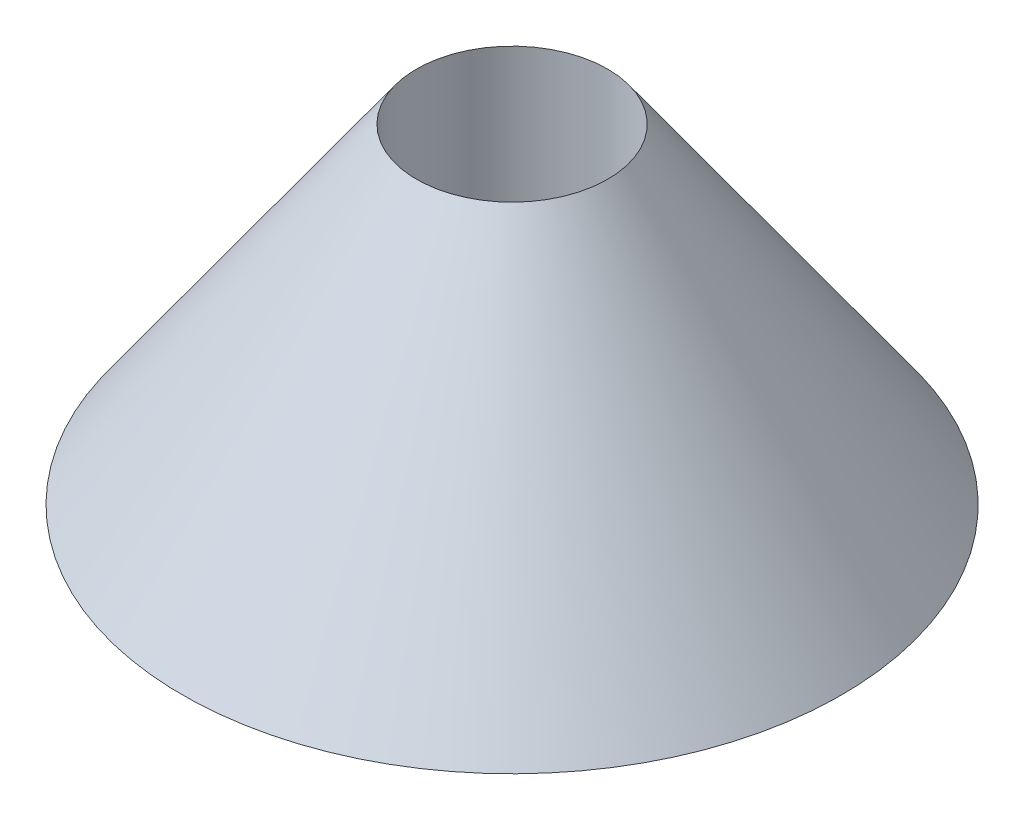
ISO-10303-21;
HEADER;
FILE_DESCRIPTION(('STEP AP214'),'2;1');
FILE_NAME('part.step','',(''),(''),'','','');
FILE_SCHEMA(('AUTOMOTIVE_DESIGN { 1 0 10303 214 1 1 1 1 }'));
ENDSEC;
DATA;
#1=APPLICATION_CONTEXT('core data for automotive mechanical design processes');
#2=APPLICATION_PROTOCOL_DEFINITION('international standard','automotive_design',2000,#1);
#3=PRODUCT_CONTEXT('',#1,'mechanical');
#4=PRODUCT('Part','Part','',(#3));
#5=PRODUCT_RELATED_PRODUCT_CATEGORY('part','',(#4));
#6=PRODUCT_DEFINITION_FORMATION('','',#4);
#7=PRODUCT_DEFINITION_CONTEXT('part definition',#1,'design');
#8=PRODUCT_DEFINITION('design','',#6,#7);
#9=PRODUCT_DEFINITION_SHAPE('','',#8);
#10=(LENGTH_UNIT() NAMED_UNIT(*) SI_UNIT(.MILLI.,.METRE.));
#11=(NAMED_UNIT(*) PLANE_ANGLE_UNIT() SI_UNIT($,.RADIAN.));
#12=(NAMED_UNIT(*) SI_UNIT($,.STERADIAN.) SOLID_ANGLE_UNIT());
#13=UNCERTAINTY_MEASURE_WITH_UNIT(LENGTH_MEASURE(1.E-05),#10,'distance_accuracy_value','');
#14=(GEOMETRIC_REPRESENTATION_CONTEXT(3) GLOBAL_UNCERTAINTY_ASSIGNED_CONTEXT((#13)) GLOBAL_UNIT_ASSIGNED_CONTEXT((#10,
#11,#12)) REPRESENTATION_CONTEXT('',''));
#15=CARTESIAN_POINT('',(0.,0.,0.));
#16=DIRECTION('',(0.,0.,1.));
#17=DIRECTION('',(1.,0.,0.));
#18=AXIS2_PLACEMENT_3D('',#15,#16,#17);
#19=CARTESIAN_POINT('',(-59.9660857797053,-9.31332767402377,0.));
#20=DIRECTION('',(0.,-1.,0.));
#21=DIRECTION('',(0.,0.,-1.));
#22=AXIS2_PLACEMENT_3D('',#19,#20,#21);
#23=PLANE('',#22);
#24=CARTESIAN_POINT('',(-59.9660857797053,-9.31332767402377,0.));
#25=DIRECTION('',(0.,-1.,0.));
#26=DIRECTION('',(0.,0.,-1.));
#27=AXIS2_PLACEMENT_3D('',#24,#25,#26);
#28=CIRCLE('',#27,1.45);
#29=CARTESIAN_POINT('',(-59.9660857797053,-9.31332767402377,-1.45));
#30=VERTEX_POINT('',#29);
#31=EDGE_CURVE('E10',#30,#30,#28,.T.);
#32=ORIENTED_EDGE('',*,*,#31,.F.);
#33=EDGE_LOOP('',(#32));
#34=FACE_BOUND('',#33,.T.);
#35=ADVANCED_FACE('F31',(#34),#23,.F.);
#36=CARTESIAN_POINT('',(-59.9660857797053,-10.8133276740238,0.));
#37=DIRECTION('',(0.,-1.,0.));
#38=DIRECTION('',(0.,0.,-1.));
#39=AXIS2_PLACEMENT_3D('',#36,#37,#38);
#40=CYLINDRICAL_SURFACE('',#39,1.45);
#41=CARTESIAN_POINT('',(-59.9660857797053,-5.81332767402377,0.));
#42=DIRECTION('',(0.,-1.,0.));
#43=DIRECTION('',(0.,0.,-1.));
#44=AXIS2_PLACEMENT_3D('',#41,#42,#43);
#45=CIRCLE('',#44,1.45);
#46=CARTESIAN_POINT('',(-59.9660857797053,-5.81332767402376,-1.45));
#47=VERTEX_POINT('',#46);
#48=EDGE_CURVE('E37',#47,#47,#45,.T.);
#49=ORIENTED_EDGE('',*,*,#48,.F.);
#50=EDGE_LOOP('',(#49));
#51=FACE_BOUND('',#50,.T.);
#52=ORIENTED_EDGE('',*,*,#31,.T.);
#53=EDGE_LOOP('',(#52));
#54=FACE_BOUND('',#53,.T.);
#55=ADVANCED_FACE('F52',(#51,#54),#40,.F.);
#56=CARTESIAN_POINT('',(-59.9660857797053,-5.81332767402377,0.));
#57=DIRECTION('',(0.,-1.,0.));
#58=DIRECTION('',(0.,0.,-1.));
#59=AXIS2_PLACEMENT_3D('',#56,#57,#58);
#60=CONICAL_SURFACE('',#59,1.45,0.617405891751572);
#61=CARTESIAN_POINT('',(-59.9660857797053,-10.8133276740238,0.));
#62=DIRECTION('',(0.,-1.,0.));
#63=DIRECTION('',(0.,0.,-1.));
#64=AXIS2_PLACEMENT_3D('',#61,#62,#63);
#65=CIRCLE('',#64,5.);
#66=CARTESIAN_POINT('',(-59.9660857797053,-10.8133276740238,-5.));
#67=VERTEX_POINT('',#66);
#68=EDGE_CURVE('E41',#67,#67,#65,.T.);
#69=CARTESIAN_POINT('',(-59.9660857797053,-10.8133276740238,-5.));
#70=CARTESIAN_POINT('',(-59.9660857797053,-10.7612443406904,-4.96302083333333));
#71=CARTESIAN_POINT('',(-59.9660857797053,-10.7091610073571,-4.92604166666666));
#72=CARTESIAN_POINT('',(-59.9660857797053,-10.6049943406904,-4.85208333333333));
#73=CARTESIAN_POINT('',(-59.9660857797053,-10.5529110073571,-4.81510416666666));
#74=CARTESIAN_POINT('',(-59.9660857797053,-10.4487443406904,-4.74114583333333));
#75=CARTESIAN_POINT('',(-59.9660857797053,-10.3966610073571,-4.70416666666666));
#76=CARTESIAN_POINT('',(-59.9660857797053,-10.2924943406904,-4.63020833333333));
#77=CARTESIAN_POINT('',(-59.9660857797053,-10.2404110073571,-4.59322916666666));
#78=CARTESIAN_POINT('',(-59.9660857797053,-10.1362443406904,-4.51927083333333));
#79=CARTESIAN_POINT('',(-59.9660857797053,-10.0841610073571,-4.48229166666666));
#80=CARTESIAN_POINT('',(-59.9660857797053,-9.97999434069043,-4.40833333333333));
#81=CARTESIAN_POINT('',(-59.9660857797053,-9.9279110073571,-4.37135416666666));
#82=CARTESIAN_POINT('',(-59.9660857797053,-9.82374434069043,-4.29739583333333));
#83=CARTESIAN_POINT('',(-59.9660857797053,-9.7716610073571,-4.26041666666666));
#84=CARTESIAN_POINT('',(-59.9660857797053,-9.66749434069043,-4.18645833333333));
#85=CARTESIAN_POINT('',(-59.9660857797053,-9.6154110073571,-4.14947916666666));
#86=CARTESIAN_POINT('',(-59.9660857797053,-9.51124434069043,-4.07552083333333));
#87=CARTESIAN_POINT('',(-59.9660857797053,-9.4591610073571,-4.03854166666667));
#88=CARTESIAN_POINT('',(-59.9660857797053,-9.35499434069043,-3.96458333333333));
#89=CARTESIAN_POINT('',(-59.9660857797053,-9.3029110073571,-3.92760416666666));
#90=CARTESIAN_POINT('',(-59.9660857797053,-9.19874434069043,-3.85364583333333));
#91=CARTESIAN_POINT('',(-59.9660857797053,-9.1466610073571,-3.81666666666666));
#92=CARTESIAN_POINT('',(-59.9660857797053,-9.04249434069043,-3.74270833333333));
#93=CARTESIAN_POINT('',(-59.9660857797053,-8.9904110073571,-3.70572916666666));
#94=CARTESIAN_POINT('',(-59.9660857797053,-8.88624434069043,-3.63177083333333));
#95=CARTESIAN_POINT('',(-59.9660857797053,-8.8341610073571,-3.59479166666666));
#96=CARTESIAN_POINT('',(-59.9660857797053,-8.72999434069043,-3.52083333333333));
#97=CARTESIAN_POINT('',(-59.9660857797053,-8.6779110073571,-3.48385416666666));
#98=CARTESIAN_POINT('',(-59.9660857797053,-8.57374434069043,-3.40989583333333));
#99=CARTESIAN_POINT('',(-59.9660857797053,-8.5216610073571,-3.37291666666666));
#100=CARTESIAN_POINT('',(-59.9660857797053,-8.41749434069043,-3.29895833333333));
#101=CARTESIAN_POINT('',(-59.9660857797053,-8.3654110073571,-3.26197916666666));
#102=CARTESIAN_POINT('',(-59.9660857797053,-8.26124434069043,-3.18802083333333));
#103=CARTESIAN_POINT('',(-59.9660857797053,-8.2091610073571,-3.15104166666666));
#104=CARTESIAN_POINT('',(-59.9660857797053,-8.10499434069043,-3.07708333333333));
#105=CARTESIAN_POINT('',(-59.9660857797053,-8.0529110073571,-3.04010416666666));
#106=CARTESIAN_POINT('',(-59.9660857797053,-7.94874434069043,-2.96614583333333));
#107=CARTESIAN_POINT('',(-59.9660857797053,-7.8966610073571,-2.92916666666666));
#108=CARTESIAN_POINT('',(-59.9660857797053,-7.79249434069043,-2.85520833333333));
#109=CARTESIAN_POINT('',(-59.9660857797053,-7.7404110073571,-2.81822916666666));
#110=CARTESIAN_POINT('',(-59.9660857797053,-7.63624434069043,-2.74427083333333));
#111=CARTESIAN_POINT('',(-59.9660857797053,-7.5841610073571,-2.70729166666666));
#112=CARTESIAN_POINT('',(-59.9660857797053,-7.47999434069043,-2.63333333333333));
#113=CARTESIAN_POINT('',(-59.9660857797053,-7.4279110073571,-2.59635416666667));
#114=CARTESIAN_POINT('',(-59.9660857797053,-7.32374434069043,-2.52239583333333));
#115=CARTESIAN_POINT('',(-59.9660857797053,-7.2716610073571,-2.48541666666666));
#116=CARTESIAN_POINT('',(-59.9660857797053,-7.16749434069043,-2.41145833333333));
#117=CARTESIAN_POINT('',(-59.9660857797053,-7.1154110073571,-2.37447916666667));
#118=CARTESIAN_POINT('',(-59.9660857797053,-7.01124434069043,-2.30052083333333));
#119=CARTESIAN_POINT('',(-59.9660857797053,-6.9591610073571,-2.26354166666667));
#120=CARTESIAN_POINT('',(-59.9660857797053,-6.85499434069043,-2.18958333333333));
#121=CARTESIAN_POINT('',(-59.9660857797053,-6.8029110073571,-2.15260416666667));
#122=CARTESIAN_POINT('',(-59.9660857797053,-6.69874434069043,-2.07864583333333));
#123=CARTESIAN_POINT('',(-59.9660857797053,-6.6466610073571,-2.04166666666667));
#124=CARTESIAN_POINT('',(-59.9660857797053,-6.54249434069043,-1.96770833333333));
#125=CARTESIAN_POINT('',(-59.9660857797053,-6.4904110073571,-1.93072916666667));
#126=CARTESIAN_POINT('',(-59.9660857797053,-6.38624434069043,-1.85677083333333));
#127=CARTESIAN_POINT('',(-59.9660857797053,-6.3341610073571,-1.81979166666667));
#128=CARTESIAN_POINT('',(-59.9660857797053,-6.22999434069043,-1.74583333333333));
#129=CARTESIAN_POINT('',(-59.9660857797053,-6.1779110073571,-1.70885416666667));
#130=CARTESIAN_POINT('',(-59.9660857797053,-6.07374434069043,-1.63489583333333));
#131=CARTESIAN_POINT('',(-59.9660857797053,-6.0216610073571,-1.59791666666667));
#132=CARTESIAN_POINT('',(-59.9660857797053,-5.91749434069043,-1.52395833333333));
#133=CARTESIAN_POINT('',(-59.9660857797053,-5.8654110073571,-1.48697916666667));
#134=CARTESIAN_POINT('',(-59.9660857797053,-5.81332767402376,-1.45));
#135=B_SPLINE_CURVE_WITH_KNOTS('',3,(#69,#70,#71,#72,#73,#74,#75,#76,#77,#78,#79,#80,#81,#82,
#83,#84,#85,#86,#87,#88,#89,#90,#91,#92,#93,#94,#95,#96,#97,#98,#99,#100,#101,#102,#103,#104,
#105,#106,#107,#108,#109,#110,#111,#112,#113,#114,#115,#116,#117,#118,#119,#120,#121,#122,#123,
#124,#125,#126,#127,#128,#129,#130,#131,#132,#133,#134),.UNSPECIFIED.,.F.,.F.,(4,2,2,2,2,2,2,2,
2,2,2,2,2,2,2,2,2,2,2,2,2,2,2,2,2,2,2,2,2,2,2,2,4),(0.,0.1916277417449,0.3832554834898,
0.574883225234698,0.766510966979598,0.958138708724498,1.1497664504694,1.3413941922143,
1.5330219339592,1.7246496757041,1.916277417449,2.1079051591939,2.2995329009388,2.4911606426837,
2.6827883844286,2.87441612617349,3.06604386791839,3.25767160966329,3.44929935140819,
3.64092709315309,3.83255483489799,4.02418257664289,4.21581031838779,4.40743806013269,
4.59906580187759,4.79069354362249,4.98232128536739,5.17394902711229,5.36557676885719,
5.55720451060209,5.74883225234699,5.94045999409189,6.13208773583679),.UNSPECIFIED.);
#136=EDGE_CURVE('BSEAM50',#67,#47,#135,.T.);
#137=ORIENTED_EDGE('',*,*,#68,.F.);
#138=ORIENTED_EDGE('',*,*,#48,.T.);
#139=ORIENTED_EDGE('',*,*,#136,.T.);
#140=ORIENTED_EDGE('',*,*,#136,.F.);
#141=EDGE_LOOP('',(#137,#139,#138,#140));
#142=FACE_BOUND('',#141,.T.);
#143=ADVANCED_FACE('F50',(#142),#60,.T.);
#144=CARTESIAN_POINT('',(-59.9660857797053,-10.8133276740238,0.));
#145=DIRECTION('',(0.,1.,0.));
#146=DIRECTION('',(0.,0.,1.));
#147=AXIS2_PLACEMENT_3D('',#144,#145,#146);
#148=PLANE('',#147);
#149=ORIENTED_EDGE('',*,*,#68,.T.);
#150=EDGE_LOOP('',(#149));
#151=FACE_BOUND('',#150,.T.);
#152=ADVANCED_FACE('F48',(#151),#148,.F.);
#153=CLOSED_SHELL('',(#35,#55,#143,#152));
#154=MANIFOLD_SOLID_BREP('B2',#153);
#155=ADVANCED_BREP_SHAPE_REPRESENTATION('',(#18,#154),#14);
#156=SHAPE_DEFINITION_REPRESENTATION(#9,#155);
ENDSEC;
END-ISO-10303-21;
